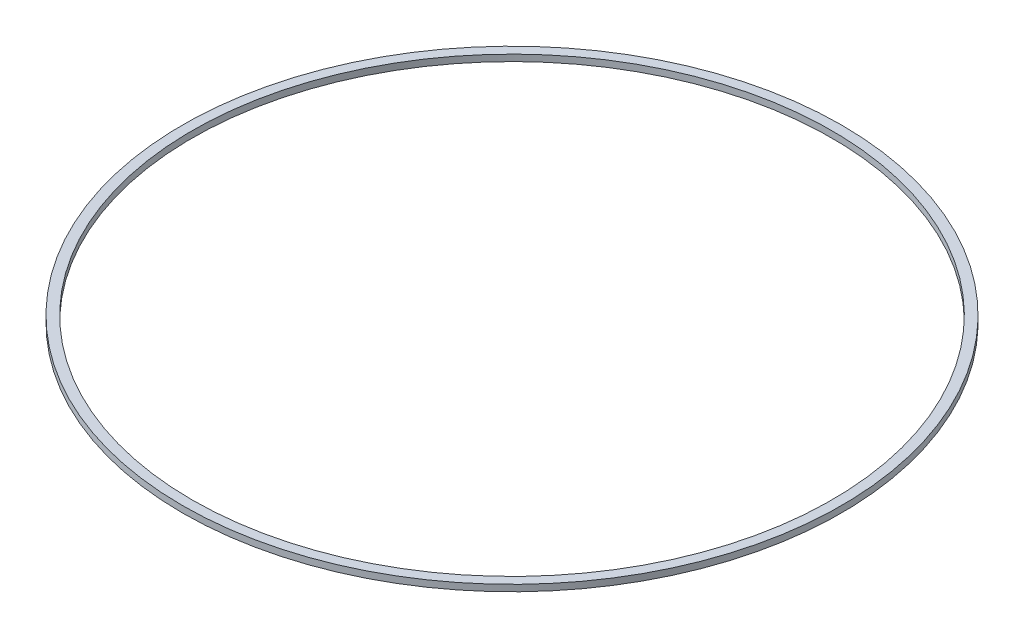
ISO-10303-21;
HEADER;
FILE_DESCRIPTION(('STEP AP214'),'2;1');
FILE_NAME('part.step','',(''),(''),'','','');
FILE_SCHEMA(('AUTOMOTIVE_DESIGN { 1 0 10303 214 1 1 1 1 }'));
ENDSEC;
DATA;
#1=APPLICATION_CONTEXT('core data for automotive mechanical design processes');
#2=APPLICATION_PROTOCOL_DEFINITION('international standard','automotive_design',2000,#1);
#3=PRODUCT_CONTEXT('',#1,'mechanical');
#4=PRODUCT('Part','Part','',(#3));
#5=PRODUCT_RELATED_PRODUCT_CATEGORY('part','',(#4));
#6=PRODUCT_DEFINITION_FORMATION('','',#4);
#7=PRODUCT_DEFINITION_CONTEXT('part definition',#1,'design');
#8=PRODUCT_DEFINITION('design','',#6,#7);
#9=PRODUCT_DEFINITION_SHAPE('','',#8);
#10=(LENGTH_UNIT() NAMED_UNIT(*) SI_UNIT(.MILLI.,.METRE.));
#11=(NAMED_UNIT(*) PLANE_ANGLE_UNIT() SI_UNIT($,.RADIAN.));
#12=(NAMED_UNIT(*) SI_UNIT($,.STERADIAN.) SOLID_ANGLE_UNIT());
#13=UNCERTAINTY_MEASURE_WITH_UNIT(LENGTH_MEASURE(1.E-05),#10,'distance_accuracy_value','');
#14=(GEOMETRIC_REPRESENTATION_CONTEXT(3) GLOBAL_UNCERTAINTY_ASSIGNED_CONTEXT((#13)) GLOBAL_UNIT_ASSIGNED_CONTEXT((#10,
#11,#12)) REPRESENTATION_CONTEXT('',''));
#15=CARTESIAN_POINT('',(0.,0.,0.));
#16=DIRECTION('',(0.,0.,1.));
#17=DIRECTION('',(1.,0.,0.));
#18=AXIS2_PLACEMENT_3D('',#15,#16,#17);
#19=CARTESIAN_POINT('',(0.,2.,0.));
#20=DIRECTION('',(0.,1.,0.));
#21=DIRECTION('',(0.,0.,1.));
#22=AXIS2_PLACEMENT_3D('',#19,#20,#21);
#23=PLANE('',#22);
#24=CARTESIAN_POINT('',(0.,2.,0.));
#25=DIRECTION('',(0.,1.,0.));
#26=DIRECTION('',(0.,0.,1.));
#27=AXIS2_PLACEMENT_3D('',#24,#25,#26);
#28=CIRCLE('',#27,101.9);
#29=CARTESIAN_POINT('',(0.,2.,101.9));
#30=VERTEX_POINT('',#29);
#31=EDGE_CURVE('E10',#30,#30,#28,.T.);
#32=ORIENTED_EDGE('',*,*,#31,.T.);
#33=EDGE_LOOP('',(#32));
#34=FACE_BOUND('',#33,.T.);
#35=CARTESIAN_POINT('',(0.,2.,0.));
#36=DIRECTION('',(0.,1.,0.));
#37=DIRECTION('',(0.,0.,1.));
#38=AXIS2_PLACEMENT_3D('',#35,#36,#37);
#39=CIRCLE('',#38,98.9);
#40=CARTESIAN_POINT('',(0.,2.,98.9));
#41=VERTEX_POINT('',#40);
#42=EDGE_CURVE('E42',#41,#41,#39,.T.);
#43=ORIENTED_EDGE('',*,*,#42,.F.);
#44=EDGE_LOOP('',(#43));
#45=FACE_BOUND('',#44,.T.);
#46=ADVANCED_FACE('F31',(#34,#45),#23,.T.);
#47=CARTESIAN_POINT('',(0.,0.,0.));
#48=DIRECTION('',(0.,1.,0.));
#49=DIRECTION('',(0.,0.,1.));
#50=AXIS2_PLACEMENT_3D('',#47,#48,#49);
#51=PLANE('',#50);
#52=CARTESIAN_POINT('',(0.,0.,0.));
#53=DIRECTION('',(0.,1.,0.));
#54=DIRECTION('',(0.,0.,1.));
#55=AXIS2_PLACEMENT_3D('',#52,#53,#54);
#56=CIRCLE('',#55,101.9);
#57=CARTESIAN_POINT('',(0.,0.,101.9));
#58=VERTEX_POINT('',#57);
#59=EDGE_CURVE('E35',#58,#58,#56,.T.);
#60=ORIENTED_EDGE('',*,*,#59,.F.);
#61=EDGE_LOOP('',(#60));
#62=FACE_BOUND('',#61,.T.);
#63=CARTESIAN_POINT('',(0.,0.,0.));
#64=DIRECTION('',(0.,1.,0.));
#65=DIRECTION('',(0.,0.,1.));
#66=AXIS2_PLACEMENT_3D('',#63,#64,#65);
#67=CIRCLE('',#66,98.9);
#68=CARTESIAN_POINT('',(0.,0.,98.9));
#69=VERTEX_POINT('',#68);
#70=EDGE_CURVE('E44',#69,#69,#67,.T.);
#71=ORIENTED_EDGE('',*,*,#70,.T.);
#72=EDGE_LOOP('',(#71));
#73=FACE_BOUND('',#72,.T.);
#74=ADVANCED_FACE('F54',(#62,#73),#51,.F.);
#75=CARTESIAN_POINT('',(0.,2.,0.));
#76=DIRECTION('',(0.,-1.,0.));
#77=DIRECTION('',(0.,0.,-1.));
#78=AXIS2_PLACEMENT_3D('',#75,#76,#77);
#79=CYLINDRICAL_SURFACE('',#78,101.9);
#80=ORIENTED_EDGE('',*,*,#31,.F.);
#81=EDGE_LOOP('',(#80));
#82=FACE_BOUND('',#81,.T.);
#83=ORIENTED_EDGE('',*,*,#59,.T.);
#84=EDGE_LOOP('',(#83));
#85=FACE_BOUND('',#84,.T.);
#86=ADVANCED_FACE('F33',(#82,#85),#79,.T.);
#87=CARTESIAN_POINT('',(0.,2.,0.));
#88=DIRECTION('',(0.,-1.,0.));
#89=DIRECTION('',(0.,0.,-1.));
#90=AXIS2_PLACEMENT_3D('',#87,#88,#89);
#91=CYLINDRICAL_SURFACE('',#90,98.9);
#92=ORIENTED_EDGE('',*,*,#42,.T.);
#93=EDGE_LOOP('',(#92));
#94=FACE_BOUND('',#93,.T.);
#95=ORIENTED_EDGE('',*,*,#70,.F.);
#96=EDGE_LOOP('',(#95));
#97=FACE_BOUND('',#96,.T.);
#98=ADVANCED_FACE('F50',(#94,#97),#91,.F.);
#99=CLOSED_SHELL('',(#46,#74,#86,#98));
#100=MANIFOLD_SOLID_BREP('B2',#99);
#101=ADVANCED_BREP_SHAPE_REPRESENTATION('',(#18,#100),#14);
#102=SHAPE_DEFINITION_REPRESENTATION(#9,#101);
ENDSEC;
END-ISO-10303-21;
